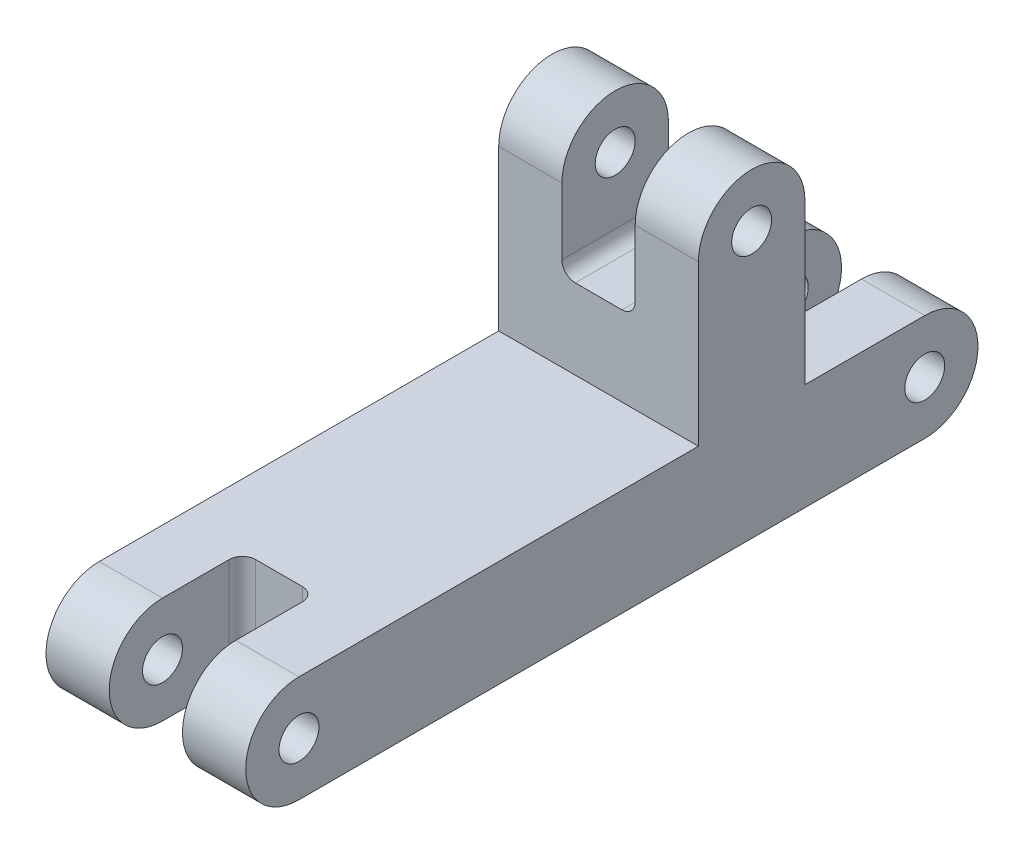
ISO-10303-21;
HEADER;
FILE_DESCRIPTION(('STEP AP214'),'2;1');
FILE_NAME('part.step','',(''),(''),'','','');
FILE_SCHEMA(('AUTOMOTIVE_DESIGN { 1 0 10303 214 1 1 1 1 }'));
ENDSEC;
DATA;
#1=APPLICATION_CONTEXT('core data for automotive mechanical design processes');
#2=APPLICATION_PROTOCOL_DEFINITION('international standard','automotive_design',2000,#1);
#3=PRODUCT_CONTEXT('',#1,'mechanical');
#4=PRODUCT('Part','Part','',(#3));
#5=PRODUCT_RELATED_PRODUCT_CATEGORY('part','',(#4));
#6=PRODUCT_DEFINITION_FORMATION('','',#4);
#7=PRODUCT_DEFINITION_CONTEXT('part definition',#1,'design');
#8=PRODUCT_DEFINITION('design','',#6,#7);
#9=PRODUCT_DEFINITION_SHAPE('','',#8);
#10=(LENGTH_UNIT() NAMED_UNIT(*) SI_UNIT(.MILLI.,.METRE.));
#11=(NAMED_UNIT(*) PLANE_ANGLE_UNIT() SI_UNIT($,.RADIAN.));
#12=(NAMED_UNIT(*) SI_UNIT($,.STERADIAN.) SOLID_ANGLE_UNIT());
#13=UNCERTAINTY_MEASURE_WITH_UNIT(LENGTH_MEASURE(1.E-05),#10,'distance_accuracy_value','');
#14=(GEOMETRIC_REPRESENTATION_CONTEXT(3) GLOBAL_UNCERTAINTY_ASSIGNED_CONTEXT((#13)) GLOBAL_UNIT_ASSIGNED_CONTEXT((#10,
#11,#12)) REPRESENTATION_CONTEXT('',''));
#15=CARTESIAN_POINT('',(0.,0.,0.));
#16=DIRECTION('',(0.,0.,1.));
#17=DIRECTION('',(1.,0.,0.));
#18=AXIS2_PLACEMENT_3D('',#15,#16,#17);
#19=CARTESIAN_POINT('',(7.5,0.,42.5));
#20=DIRECTION('',(-1.,0.,0.));
#21=DIRECTION('',(0.,0.,1.));
#22=AXIS2_PLACEMENT_3D('',#19,#20,#21);
#23=CYLINDRICAL_SURFACE('',#22,3.99999999999999);
#24=CARTESIAN_POINT('',(2.75,0.,42.5));
#25=DIRECTION('',(-1.,0.,0.));
#26=DIRECTION('',(0.,0.,1.));
#27=AXIS2_PLACEMENT_3D('',#24,#25,#26);
#28=CIRCLE('',#27,3.99999999999999);
#29=CARTESIAN_POINT('',(2.75,-3.99999999999999,42.5));
#30=VERTEX_POINT('',#29);
#31=CARTESIAN_POINT('',(2.75,3.99999999999999,42.5));
#32=VERTEX_POINT('',#31);
#33=EDGE_CURVE('E227',#30,#32,#28,.T.);
#34=ORIENTED_EDGE('',*,*,#33,.F.);
#35=DIRECTION('',(-1.,0.,0.));
#36=VECTOR('',#35,1.);
#37=CARTESIAN_POINT('',(7.5,-3.99999999999999,42.5));
#38=LINE('',#37,#36);
#39=CARTESIAN_POINT('',(7.5,-3.99999999999999,42.5));
#40=VERTEX_POINT('',#39);
#41=EDGE_CURVE('E243',#40,#30,#38,.T.);
#42=ORIENTED_EDGE('',*,*,#41,.F.);
#43=CARTESIAN_POINT('',(7.5,0.,42.5));
#44=DIRECTION('',(1.,0.,0.));
#45=DIRECTION('',(0.,0.,-1.));
#46=AXIS2_PLACEMENT_3D('',#43,#44,#45);
#47=CIRCLE('',#46,3.99999999999999);
#48=CARTESIAN_POINT('',(7.5,3.99999999999999,42.5));
#49=VERTEX_POINT('',#48);
#50=EDGE_CURVE('E236',#49,#40,#47,.T.);
#51=ORIENTED_EDGE('',*,*,#50,.F.);
#52=DIRECTION('',(-1.,0.,0.));
#53=VECTOR('',#52,1.);
#54=CARTESIAN_POINT('',(7.5,3.99999999999999,42.5));
#55=LINE('',#54,#53);
#56=EDGE_CURVE('E218',#49,#32,#55,.T.);
#57=ORIENTED_EDGE('',*,*,#56,.T.);
#58=EDGE_LOOP('',(#34,#42,#51,#57));
#59=FACE_BOUND('',#58,.T.);
#60=ADVANCED_FACE('F33',(#59),#23,.T.);
#61=CARTESIAN_POINT('',(7.5,-3.99999999999999,4.5));
#62=DIRECTION('',(0.,1.,0.));
#63=DIRECTION('',(0.,0.,1.));
#64=AXIS2_PLACEMENT_3D('',#61,#62,#63);
#65=PLANE('',#64);
#66=DIRECTION('',(1.,0.,0.));
#67=VECTOR('',#66,1.);
#68=CARTESIAN_POINT('',(-2.75,-3.99999999999999,36.5));
#69=LINE('',#68,#67);
#70=CARTESIAN_POINT('',(-1.75,-3.99999999999999,36.5));
#71=VERTEX_POINT('',#70);
#72=CARTESIAN_POINT('',(1.75,-3.99999999999999,36.5));
#73=VERTEX_POINT('',#72);
#74=EDGE_CURVE('E321',#71,#73,#69,.T.);
#75=ORIENTED_EDGE('',*,*,#74,.F.);
#76=CARTESIAN_POINT('',(-1.75,-3.99999999999999,37.5));
#77=DIRECTION('',(0.,1.,0.));
#78=DIRECTION('',(0.,0.,1.));
#79=AXIS2_PLACEMENT_3D('',#76,#77,#78);
#80=CIRCLE('',#79,1.);
#81=CARTESIAN_POINT('',(-2.75,-3.99999999999999,37.5));
#82=VERTEX_POINT('',#81);
#83=EDGE_CURVE('E11',#71,#82,#80,.T.);
#84=ORIENTED_EDGE('',*,*,#83,.T.);
#85=DIRECTION('',(0.,0.,-1.));
#86=VECTOR('',#85,1.);
#87=CARTESIAN_POINT('',(-2.75,-3.99999999999999,36.5));
#88=LINE('',#87,#86);
#89=CARTESIAN_POINT('',(-2.75,-3.99999999999999,42.5));
#90=VERTEX_POINT('',#89);
#91=EDGE_CURVE('E322',#90,#82,#88,.T.);
#92=ORIENTED_EDGE('',*,*,#91,.F.);
#93=CARTESIAN_POINT('',(-7.5,-3.99999999999999,42.5));
#94=VERTEX_POINT('',#93);
#95=EDGE_CURVE('E437',#90,#94,#38,.T.);
#96=ORIENTED_EDGE('',*,*,#95,.T.);
#97=DIRECTION('',(0.,0.,-1.));
#98=VECTOR('',#97,1.);
#99=CARTESIAN_POINT('',(-7.5,-3.99999999999999,4.5));
#100=LINE('',#99,#98);
#101=CARTESIAN_POINT('',(-7.5,-3.99999999999999,-4.5));
#102=VERTEX_POINT('',#101);
#103=EDGE_CURVE('E400',#94,#102,#100,.T.);
#104=ORIENTED_EDGE('',*,*,#103,.T.);
#105=DIRECTION('',(-1.,0.,0.));
#106=VECTOR('',#105,1.);
#107=CARTESIAN_POINT('',(7.5,-3.99999999999999,-4.5));
#108=LINE('',#107,#106);
#109=CARTESIAN_POINT('',(-2.75,-3.99999999999999,-4.5));
#110=VERTEX_POINT('',#109);
#111=EDGE_CURVE('E434',#110,#102,#108,.T.);
#112=ORIENTED_EDGE('',*,*,#111,.F.);
#113=DIRECTION('',(0.,0.,-1.));
#114=VECTOR('',#113,1.);
#115=CARTESIAN_POINT('',(-2.75,-3.99999999999999,7.5));
#116=LINE('',#115,#114);
#117=CARTESIAN_POINT('',(-2.75,-3.99999999999999,6.5));
#118=VERTEX_POINT('',#117);
#119=EDGE_CURVE('E335',#118,#110,#116,.T.);
#120=ORIENTED_EDGE('',*,*,#119,.F.);
#121=CARTESIAN_POINT('',(-1.75,-3.99999999999999,6.5));
#122=DIRECTION('',(0.,1.,0.));
#123=DIRECTION('',(0.,0.,1.));
#124=AXIS2_PLACEMENT_3D('',#121,#122,#123);
#125=CIRCLE('',#124,1.);
#126=CARTESIAN_POINT('',(-1.75,-3.99999999999999,7.5));
#127=VERTEX_POINT('',#126);
#128=EDGE_CURVE('E309',#118,#127,#125,.T.);
#129=ORIENTED_EDGE('',*,*,#128,.T.);
#130=DIRECTION('',(1.,0.,0.));
#131=VECTOR('',#130,1.);
#132=CARTESIAN_POINT('',(-2.75,-3.99999999999999,7.5));
#133=LINE('',#132,#131);
#134=CARTESIAN_POINT('',(1.75,-3.99999999999999,7.5));
#135=VERTEX_POINT('',#134);
#136=EDGE_CURVE('E349',#127,#135,#133,.T.);
#137=ORIENTED_EDGE('',*,*,#136,.T.);
#138=CARTESIAN_POINT('',(1.75,-3.99999999999999,6.5));
#139=DIRECTION('',(0.,1.,0.));
#140=DIRECTION('',(0.,0.,1.));
#141=AXIS2_PLACEMENT_3D('',#138,#139,#140);
#142=CIRCLE('',#141,1.);
#143=CARTESIAN_POINT('',(2.75,-3.99999999999999,6.5));
#144=VERTEX_POINT('',#143);
#145=EDGE_CURVE('E307',#135,#144,#142,.T.);
#146=ORIENTED_EDGE('',*,*,#145,.T.);
#147=DIRECTION('',(0.,0.,-1.));
#148=VECTOR('',#147,1.);
#149=CARTESIAN_POINT('',(2.75,-3.99999999999999,7.5));
#150=LINE('',#149,#148);
#151=CARTESIAN_POINT('',(2.75,-3.99999999999999,-4.5));
#152=VERTEX_POINT('',#151);
#153=EDGE_CURVE('E342',#144,#152,#150,.T.);
#154=ORIENTED_EDGE('',*,*,#153,.T.);
#155=CARTESIAN_POINT('',(7.5,-3.99999999999999,-4.5));
#156=VERTEX_POINT('',#155);
#157=EDGE_CURVE('E435',#156,#152,#108,.T.);
#158=ORIENTED_EDGE('',*,*,#157,.F.);
#159=DIRECTION('',(0.,0.,-1.));
#160=VECTOR('',#159,1.);
#161=CARTESIAN_POINT('',(7.5,-3.99999999999999,4.5));
#162=LINE('',#161,#160);
#163=EDGE_CURVE('E382',#40,#156,#162,.T.);
#164=ORIENTED_EDGE('',*,*,#163,.F.);
#165=ORIENTED_EDGE('',*,*,#41,.T.);
#166=DIRECTION('',(0.,0.,-1.));
#167=VECTOR('',#166,1.);
#168=CARTESIAN_POINT('',(2.75,-3.99999999999999,36.5));
#169=LINE('',#168,#167);
#170=CARTESIAN_POINT('',(2.75,-3.99999999999999,37.5));
#171=VERTEX_POINT('',#170);
#172=EDGE_CURVE('E223',#30,#171,#169,.T.);
#173=ORIENTED_EDGE('',*,*,#172,.T.);
#174=CARTESIAN_POINT('',(1.75,-3.99999999999999,37.5));
#175=DIRECTION('',(0.,1.,0.));
#176=DIRECTION('',(0.,0.,1.));
#177=AXIS2_PLACEMENT_3D('',#174,#175,#176);
#178=CIRCLE('',#177,1.);
#179=EDGE_CURVE('E312',#171,#73,#178,.T.);
#180=ORIENTED_EDGE('',*,*,#179,.T.);
#181=EDGE_LOOP('',(#75,#84,#92,#96,#104,#112,#120,#129,#137,#146,#154,#158,#164,#165,#173,#180));
#182=FACE_BOUND('',#181,.T.);
#183=ADVANCED_FACE('F450',(#182),#65,.F.);
#184=CARTESIAN_POINT('',(7.5,0.,-4.5));
#185=DIRECTION('',(-1.,0.,0.));
#186=DIRECTION('',(0.,0.,1.));
#187=AXIS2_PLACEMENT_3D('',#184,#185,#186);
#188=CYLINDRICAL_SURFACE('',#187,3.99999999999999);
#189=CARTESIAN_POINT('',(-2.75,0.,-4.5));
#190=DIRECTION('',(1.,0.,0.));
#191=DIRECTION('',(0.,0.,-1.));
#192=AXIS2_PLACEMENT_3D('',#189,#190,#191);
#193=CIRCLE('',#192,3.99999999999999);
#194=CARTESIAN_POINT('',(-2.75,3.99999999999999,-4.5));
#195=VERTEX_POINT('',#194);
#196=EDGE_CURVE('E267',#110,#195,#193,.T.);
#197=ORIENTED_EDGE('',*,*,#196,.F.);
#198=ORIENTED_EDGE('',*,*,#111,.T.);
#199=CARTESIAN_POINT('',(-7.5,0.,-4.5));
#200=DIRECTION('',(1.,0.,0.));
#201=DIRECTION('',(0.,0.,-1.));
#202=AXIS2_PLACEMENT_3D('',#199,#200,#201);
#203=CIRCLE('',#202,3.99999999999999);
#204=CARTESIAN_POINT('',(-7.5,3.99999999999999,-4.5));
#205=VERTEX_POINT('',#204);
#206=EDGE_CURVE('E403',#102,#205,#203,.T.);
#207=ORIENTED_EDGE('',*,*,#206,.T.);
#208=DIRECTION('',(-1.,0.,0.));
#209=VECTOR('',#208,1.);
#210=CARTESIAN_POINT('',(7.5,3.99999999999999,-4.5));
#211=LINE('',#210,#209);
#212=EDGE_CURVE('E430',#195,#205,#211,.T.);
#213=ORIENTED_EDGE('',*,*,#212,.F.);
#214=EDGE_LOOP('',(#197,#198,#207,#213));
#215=FACE_BOUND('',#214,.T.);
#216=ADVANCED_FACE('F444',(#215),#188,.T.);
#217=CARTESIAN_POINT('',(7.5,3.99999999999999,4.5));
#218=DIRECTION('',(0.,-1.,0.));
#219=DIRECTION('',(0.,0.,-1.));
#220=AXIS2_PLACEMENT_3D('',#217,#218,#219);
#221=PLANE('',#220);
#222=DIRECTION('',(0.,0.,1.));
#223=VECTOR('',#222,1.);
#224=CARTESIAN_POINT('',(-2.75,3.99999999999999,7.5));
#225=LINE('',#224,#223);
#226=CARTESIAN_POINT('',(-2.75,3.99999999999999,4.5));
#227=VERTEX_POINT('',#226);
#228=EDGE_CURVE('E341',#195,#227,#225,.T.);
#229=ORIENTED_EDGE('',*,*,#228,.F.);
#230=ORIENTED_EDGE('',*,*,#212,.T.);
#231=DIRECTION('',(0.,0.,1.));
#232=VECTOR('',#231,1.);
#233=CARTESIAN_POINT('',(-7.5,3.99999999999999,4.5));
#234=LINE('',#233,#232);
#235=CARTESIAN_POINT('',(-7.5,3.99999999999999,4.5));
#236=VERTEX_POINT('',#235);
#237=EDGE_CURVE('E406',#205,#236,#234,.T.);
#238=ORIENTED_EDGE('',*,*,#237,.T.);
#239=DIRECTION('',(-1.,0.,0.));
#240=VECTOR('',#239,1.);
#241=CARTESIAN_POINT('',(7.5,3.99999999999999,4.5));
#242=LINE('',#241,#240);
#243=EDGE_CURVE('E426',#227,#236,#242,.T.);
#244=ORIENTED_EDGE('',*,*,#243,.F.);
#245=EDGE_LOOP('',(#229,#230,#238,#244));
#246=FACE_BOUND('',#245,.T.);
#247=ADVANCED_FACE('F461',(#246),#221,.F.);
#248=CARTESIAN_POINT('',(7.5,16.,8.5));
#249=DIRECTION('',(-1.,0.,0.));
#250=DIRECTION('',(0.,0.,1.));
#251=AXIS2_PLACEMENT_3D('',#248,#249,#250);
#252=CYLINDRICAL_SURFACE('',#251,4.);
#253=CARTESIAN_POINT('',(2.75,16.,8.5));
#254=DIRECTION('',(-1.,0.,0.));
#255=DIRECTION('',(0.,0.,1.));
#256=AXIS2_PLACEMENT_3D('',#253,#254,#255);
#257=CIRCLE('',#256,4.);
#258=CARTESIAN_POINT('',(2.75,16.,12.5));
#259=VERTEX_POINT('',#258);
#260=CARTESIAN_POINT('',(2.75,16.,4.5));
#261=VERTEX_POINT('',#260);
#262=EDGE_CURVE('E256',#259,#261,#257,.T.);
#263=ORIENTED_EDGE('',*,*,#262,.F.);
#264=DIRECTION('',(-1.,0.,0.));
#265=VECTOR('',#264,1.);
#266=CARTESIAN_POINT('',(7.5,16.,12.5));
#267=LINE('',#266,#265);
#268=CARTESIAN_POINT('',(7.5,16.,12.5));
#269=VERTEX_POINT('',#268);
#270=EDGE_CURVE('E419',#269,#259,#267,.T.);
#271=ORIENTED_EDGE('',*,*,#270,.F.);
#272=CARTESIAN_POINT('',(7.5,16.,8.5));
#273=DIRECTION('',(1.,0.,0.));
#274=DIRECTION('',(0.,0.,-1.));
#275=AXIS2_PLACEMENT_3D('',#272,#273,#274);
#276=CIRCLE('',#275,4.);
#277=CARTESIAN_POINT('',(7.5,16.,4.5));
#278=VERTEX_POINT('',#277);
#279=EDGE_CURVE('E390',#278,#269,#276,.T.);
#280=ORIENTED_EDGE('',*,*,#279,.F.);
#281=DIRECTION('',(-1.,0.,0.));
#282=VECTOR('',#281,1.);
#283=CARTESIAN_POINT('',(7.5,16.,4.5));
#284=LINE('',#283,#282);
#285=EDGE_CURVE('E423',#278,#261,#284,.T.);
#286=ORIENTED_EDGE('',*,*,#285,.T.);
#287=EDGE_LOOP('',(#263,#271,#280,#286));
#288=FACE_BOUND('',#287,.T.);
#289=ADVANCED_FACE('F547',(#288),#252,.T.);
#290=CARTESIAN_POINT('',(7.5,0.,-4.5));
#291=DIRECTION('',(-1.,0.,0.));
#292=DIRECTION('',(0.,0.,1.));
#293=AXIS2_PLACEMENT_3D('',#290,#291,#292);
#294=CYLINDRICAL_SURFACE('',#293,1.5);
#295=CARTESIAN_POINT('',(-7.5,0.,-4.5));
#296=DIRECTION('',(1.,0.,0.));
#297=DIRECTION('',(0.,0.,-1.));
#298=AXIS2_PLACEMENT_3D('',#295,#296,#297);
#299=CIRCLE('',#298,1.5);
#300=CARTESIAN_POINT('',(-7.5,0.,-6.));
#301=VERTEX_POINT('',#300);
#302=EDGE_CURVE('E369',#301,#301,#299,.T.);
#303=ORIENTED_EDGE('',*,*,#302,.F.);
#304=EDGE_LOOP('',(#303));
#305=FACE_BOUND('',#304,.T.);
#306=CARTESIAN_POINT('',(-2.75,0.,-4.5));
#307=DIRECTION('',(1.,0.,0.));
#308=DIRECTION('',(0.,0.,-1.));
#309=AXIS2_PLACEMENT_3D('',#306,#307,#308);
#310=CIRCLE('',#309,1.5);
#311=CARTESIAN_POINT('',(-2.75,0.,-6.));
#312=VERTEX_POINT('',#311);
#313=EDGE_CURVE('E265',#312,#312,#310,.T.);
#314=ORIENTED_EDGE('',*,*,#313,.T.);
#315=EDGE_LOOP('',(#314));
#316=FACE_BOUND('',#315,.T.);
#317=ADVANCED_FACE('F607',(#305,#316),#294,.F.);
#318=CARTESIAN_POINT('',(7.5,16.,8.5));
#319=DIRECTION('',(-1.,0.,0.));
#320=DIRECTION('',(0.,0.,1.));
#321=AXIS2_PLACEMENT_3D('',#318,#319,#320);
#322=CYLINDRICAL_SURFACE('',#321,1.49999999999999);
#323=CARTESIAN_POINT('',(7.5,16.,8.5));
#324=DIRECTION('',(1.,0.,0.));
#325=DIRECTION('',(0.,0.,-1.));
#326=AXIS2_PLACEMENT_3D('',#323,#324,#325);
#327=CIRCLE('',#326,1.49999999999999);
#328=CARTESIAN_POINT('',(7.5,16.,7.00000000000001));
#329=VERTEX_POINT('',#328);
#330=EDGE_CURVE('E366',#329,#329,#327,.T.);
#331=ORIENTED_EDGE('',*,*,#330,.T.);
#332=EDGE_LOOP('',(#331));
#333=FACE_BOUND('',#332,.T.);
#334=CARTESIAN_POINT('',(2.75,16.,8.5));
#335=DIRECTION('',(-1.,0.,0.));
#336=DIRECTION('',(0.,0.,1.));
#337=AXIS2_PLACEMENT_3D('',#334,#335,#336);
#338=CIRCLE('',#337,1.49999999999999);
#339=CARTESIAN_POINT('',(2.75,16.,9.99999999999999));
#340=VERTEX_POINT('',#339);
#341=EDGE_CURVE('E253',#340,#340,#338,.T.);
#342=ORIENTED_EDGE('',*,*,#341,.T.);
#343=EDGE_LOOP('',(#342));
#344=FACE_BOUND('',#343,.T.);
#345=ADVANCED_FACE('F603',(#333,#344),#322,.F.);
#346=CARTESIAN_POINT('',(7.5,0.,42.5));
#347=DIRECTION('',(-1.,0.,0.));
#348=DIRECTION('',(0.,0.,1.));
#349=AXIS2_PLACEMENT_3D('',#346,#347,#348);
#350=CYLINDRICAL_SURFACE('',#349,1.5);
#351=CARTESIAN_POINT('',(7.5,0.,42.5));
#352=DIRECTION('',(1.,0.,0.));
#353=DIRECTION('',(0.,0.,-1.));
#354=AXIS2_PLACEMENT_3D('',#351,#352,#353);
#355=CIRCLE('',#354,1.5);
#356=CARTESIAN_POINT('',(7.5,0.,41.));
#357=VERTEX_POINT('',#356);
#358=EDGE_CURVE('E360',#357,#357,#355,.T.);
#359=ORIENTED_EDGE('',*,*,#358,.T.);
#360=EDGE_LOOP('',(#359));
#361=FACE_BOUND('',#360,.T.);
#362=CARTESIAN_POINT('',(2.75,0.,42.5));
#363=DIRECTION('',(-1.,0.,0.));
#364=DIRECTION('',(0.,0.,1.));
#365=AXIS2_PLACEMENT_3D('',#362,#363,#364);
#366=CIRCLE('',#365,1.5);
#367=CARTESIAN_POINT('',(2.75,0.,44.));
#368=VERTEX_POINT('',#367);
#369=EDGE_CURVE('E234',#368,#368,#366,.T.);
#370=ORIENTED_EDGE('',*,*,#369,.T.);
#371=EDGE_LOOP('',(#370));
#372=FACE_BOUND('',#371,.T.);
#373=ADVANCED_FACE('F598',(#361,#372),#350,.F.);
#374=CARTESIAN_POINT('',(7.5,0.,42.5));
#375=DIRECTION('',(1.,0.,0.));
#376=DIRECTION('',(0.,0.,-1.));
#377=AXIS2_PLACEMENT_3D('',#374,#375,#376);
#378=PLANE('',#377);
#379=ORIENTED_EDGE('',*,*,#330,.F.);
#380=EDGE_LOOP('',(#379));
#381=FACE_BOUND('',#380,.T.);
#382=DIRECTION('',(0.,0.,1.));
#383=VECTOR('',#382,1.);
#384=CARTESIAN_POINT('',(7.5,3.99999999999999,12.5));
#385=LINE('',#384,#383);
#386=CARTESIAN_POINT('',(7.5,3.99999999999999,12.5));
#387=VERTEX_POINT('',#386);
#388=EDGE_CURVE('E378',#387,#49,#385,.T.);
#389=ORIENTED_EDGE('',*,*,#388,.T.);
#390=ORIENTED_EDGE('',*,*,#50,.T.);
#391=ORIENTED_EDGE('',*,*,#163,.T.);
#392=CARTESIAN_POINT('',(7.5,0.,-4.5));
#393=DIRECTION('',(1.,0.,0.));
#394=DIRECTION('',(0.,0.,-1.));
#395=AXIS2_PLACEMENT_3D('',#392,#393,#394);
#396=CIRCLE('',#395,3.99999999999999);
#397=CARTESIAN_POINT('',(7.5,3.99999999999999,-4.5));
#398=VERTEX_POINT('',#397);
#399=EDGE_CURVE('E384',#156,#398,#396,.T.);
#400=ORIENTED_EDGE('',*,*,#399,.T.);
#401=DIRECTION('',(0.,0.,1.));
#402=VECTOR('',#401,1.);
#403=CARTESIAN_POINT('',(7.5,3.99999999999999,4.5));
#404=LINE('',#403,#402);
#405=CARTESIAN_POINT('',(7.5,3.99999999999999,4.5));
#406=VERTEX_POINT('',#405);
#407=EDGE_CURVE('E386',#398,#406,#404,.T.);
#408=ORIENTED_EDGE('',*,*,#407,.T.);
#409=DIRECTION('',(0.,1.,0.));
#410=VECTOR('',#409,1.);
#411=CARTESIAN_POINT('',(7.5,3.99999999999999,4.5));
#412=LINE('',#411,#410);
#413=EDGE_CURVE('E388',#406,#278,#412,.T.);
#414=ORIENTED_EDGE('',*,*,#413,.T.);
#415=ORIENTED_EDGE('',*,*,#279,.T.);
#416=DIRECTION('',(0.,-1.,0.));
#417=VECTOR('',#416,1.);
#418=CARTESIAN_POINT('',(7.5,3.99999999999999,12.5));
#419=LINE('',#418,#417);
#420=EDGE_CURVE('E392',#269,#387,#419,.T.);
#421=ORIENTED_EDGE('',*,*,#420,.T.);
#422=EDGE_LOOP('',(#389,#390,#391,#400,#408,#414,#415,#421));
#423=FACE_BOUND('',#422,.T.);
#424=CARTESIAN_POINT('',(7.5,0.,-4.5));
#425=DIRECTION('',(1.,0.,0.));
#426=DIRECTION('',(0.,0.,-1.));
#427=AXIS2_PLACEMENT_3D('',#424,#425,#426);
#428=CIRCLE('',#427,1.5);
#429=CARTESIAN_POINT('',(7.5,0.,-6.));
#430=VERTEX_POINT('',#429);
#431=EDGE_CURVE('E372',#430,#430,#428,.T.);
#432=ORIENTED_EDGE('',*,*,#431,.F.);
#433=EDGE_LOOP('',(#432));
#434=FACE_BOUND('',#433,.T.);
#435=ORIENTED_EDGE('',*,*,#358,.F.);
#436=EDGE_LOOP('',(#435));
#437=FACE_BOUND('',#436,.T.);
#438=ADVANCED_FACE('F497',(#381,#423,#434,#437),#378,.T.);
#439=CARTESIAN_POINT('',(-7.5,0.,42.5));
#440=DIRECTION('',(1.,0.,0.));
#441=DIRECTION('',(0.,0.,-1.));
#442=AXIS2_PLACEMENT_3D('',#439,#440,#441);
#443=PLANE('',#442);
#444=DIRECTION('',(0.,0.,1.));
#445=VECTOR('',#444,1.);
#446=CARTESIAN_POINT('',(-7.5,3.99999999999999,12.5));
#447=LINE('',#446,#445);
#448=CARTESIAN_POINT('',(-7.5,3.99999999999999,12.5));
#449=VERTEX_POINT('',#448);
#450=CARTESIAN_POINT('',(-7.5,3.99999999999999,42.5));
#451=VERTEX_POINT('',#450);
#452=EDGE_CURVE('E375',#449,#451,#447,.T.);
#453=ORIENTED_EDGE('',*,*,#452,.F.);
#454=DIRECTION('',(0.,-1.,0.));
#455=VECTOR('',#454,1.);
#456=CARTESIAN_POINT('',(-7.5,3.99999999999999,12.5));
#457=LINE('',#456,#455);
#458=CARTESIAN_POINT('',(-7.5,16.,12.5));
#459=VERTEX_POINT('',#458);
#460=EDGE_CURVE('E380',#459,#449,#457,.T.);
#461=ORIENTED_EDGE('',*,*,#460,.F.);
#462=CARTESIAN_POINT('',(-7.5,16.,8.5));
#463=DIRECTION('',(1.,0.,0.));
#464=DIRECTION('',(0.,0.,-1.));
#465=AXIS2_PLACEMENT_3D('',#462,#463,#464);
#466=CIRCLE('',#465,4.);
#467=CARTESIAN_POINT('',(-7.5,16.,4.5));
#468=VERTEX_POINT('',#467);
#469=EDGE_CURVE('E412',#468,#459,#466,.T.);
#470=ORIENTED_EDGE('',*,*,#469,.F.);
#471=DIRECTION('',(0.,1.,0.));
#472=VECTOR('',#471,1.);
#473=CARTESIAN_POINT('',(-7.5,3.99999999999999,4.5));
#474=LINE('',#473,#472);
#475=EDGE_CURVE('E409',#236,#468,#474,.T.);
#476=ORIENTED_EDGE('',*,*,#475,.F.);
#477=ORIENTED_EDGE('',*,*,#237,.F.);
#478=ORIENTED_EDGE('',*,*,#206,.F.);
#479=ORIENTED_EDGE('',*,*,#103,.F.);
#480=CARTESIAN_POINT('',(-7.5,0.,42.5));
#481=DIRECTION('',(1.,0.,0.));
#482=DIRECTION('',(0.,0.,-1.));
#483=AXIS2_PLACEMENT_3D('',#480,#481,#482);
#484=CIRCLE('',#483,3.99999999999999);
#485=EDGE_CURVE('E397',#451,#94,#484,.T.);
#486=ORIENTED_EDGE('',*,*,#485,.F.);
#487=EDGE_LOOP('',(#453,#461,#470,#476,#477,#478,#479,#486));
#488=FACE_BOUND('',#487,.T.);
#489=ORIENTED_EDGE('',*,*,#302,.T.);
#490=EDGE_LOOP('',(#489));
#491=FACE_BOUND('',#490,.T.);
#492=CARTESIAN_POINT('',(-7.5,16.,8.5));
#493=DIRECTION('',(1.,0.,0.));
#494=DIRECTION('',(0.,0.,-1.));
#495=AXIS2_PLACEMENT_3D('',#492,#493,#494);
#496=CIRCLE('',#495,1.49999999999999);
#497=CARTESIAN_POINT('',(-7.5,16.,7.00000000000001));
#498=VERTEX_POINT('',#497);
#499=EDGE_CURVE('E363',#498,#498,#496,.T.);
#500=ORIENTED_EDGE('',*,*,#499,.T.);
#501=EDGE_LOOP('',(#500));
#502=FACE_BOUND('',#501,.T.);
#503=CARTESIAN_POINT('',(-7.5,0.,42.5));
#504=DIRECTION('',(1.,0.,0.));
#505=DIRECTION('',(0.,0.,-1.));
#506=AXIS2_PLACEMENT_3D('',#503,#504,#505);
#507=CIRCLE('',#506,1.5);
#508=CARTESIAN_POINT('',(-7.5,0.,41.));
#509=VERTEX_POINT('',#508);
#510=EDGE_CURVE('E359',#509,#509,#507,.T.);
#511=ORIENTED_EDGE('',*,*,#510,.T.);
#512=EDGE_LOOP('',(#511));
#513=FACE_BOUND('',#512,.T.);
#514=ADVANCED_FACE('F454',(#488,#491,#502,#513),#443,.F.);
#515=CARTESIAN_POINT('',(7.5,3.99999999999999,12.5));
#516=DIRECTION('',(0.,-1.,0.));
#517=DIRECTION('',(0.,0.,-1.));
#518=AXIS2_PLACEMENT_3D('',#515,#516,#517);
#519=PLANE('',#518);
#520=CARTESIAN_POINT('',(-2.75,3.99999999999999,42.5));
#521=VERTEX_POINT('',#520);
#522=EDGE_CURVE('E239',#521,#451,#55,.T.);
#523=ORIENTED_EDGE('',*,*,#522,.F.);
#524=DIRECTION('',(0.,0.,1.));
#525=VECTOR('',#524,1.);
#526=CARTESIAN_POINT('',(-2.75,3.99999999999999,36.5));
#527=LINE('',#526,#525);
#528=CARTESIAN_POINT('',(-2.75,3.99999999999999,37.5));
#529=VERTEX_POINT('',#528);
#530=EDGE_CURVE('E316',#529,#521,#527,.T.);
#531=ORIENTED_EDGE('',*,*,#530,.F.);
#532=CARTESIAN_POINT('',(-1.75,3.99999999999999,37.5));
#533=DIRECTION('',(0.,-1.,0.));
#534=DIRECTION('',(0.,0.,-1.));
#535=AXIS2_PLACEMENT_3D('',#532,#533,#534);
#536=CIRCLE('',#535,1.);
#537=CARTESIAN_POINT('',(-1.75,3.99999999999999,36.5));
#538=VERTEX_POINT('',#537);
#539=EDGE_CURVE('E41',#529,#538,#536,.T.);
#540=ORIENTED_EDGE('',*,*,#539,.T.);
#541=DIRECTION('',(1.,0.,0.));
#542=VECTOR('',#541,1.);
#543=CARTESIAN_POINT('',(-2.75,3.99999999999999,36.5));
#544=LINE('',#543,#542);
#545=CARTESIAN_POINT('',(1.75,3.99999999999999,36.5));
#546=VERTEX_POINT('',#545);
#547=EDGE_CURVE('E315',#538,#546,#544,.T.);
#548=ORIENTED_EDGE('',*,*,#547,.T.);
#549=CARTESIAN_POINT('',(1.75,3.99999999999999,37.5));
#550=DIRECTION('',(0.,-1.,0.));
#551=DIRECTION('',(0.,0.,-1.));
#552=AXIS2_PLACEMENT_3D('',#549,#550,#551);
#553=CIRCLE('',#552,1.);
#554=CARTESIAN_POINT('',(2.75,3.99999999999999,37.5));
#555=VERTEX_POINT('',#554);
#556=EDGE_CURVE('E220',#546,#555,#553,.T.);
#557=ORIENTED_EDGE('',*,*,#556,.T.);
#558=DIRECTION('',(0.,0.,1.));
#559=VECTOR('',#558,1.);
#560=CARTESIAN_POINT('',(2.75,3.99999999999999,36.5));
#561=LINE('',#560,#559);
#562=EDGE_CURVE('E212',#555,#32,#561,.T.);
#563=ORIENTED_EDGE('',*,*,#562,.T.);
#564=ORIENTED_EDGE('',*,*,#56,.F.);
#565=ORIENTED_EDGE('',*,*,#388,.F.);
#566=DIRECTION('',(-1.,0.,0.));
#567=VECTOR('',#566,1.);
#568=CARTESIAN_POINT('',(7.5,3.99999999999999,12.5));
#569=LINE('',#568,#567);
#570=EDGE_CURVE('E394',#387,#449,#569,.T.);
#571=ORIENTED_EDGE('',*,*,#570,.T.);
#572=ORIENTED_EDGE('',*,*,#452,.T.);
#573=EDGE_LOOP('',(#523,#531,#540,#548,#557,#563,#564,#565,#571,#572));
#574=FACE_BOUND('',#573,.T.);
#575=ADVANCED_FACE('F215',(#574),#519,.F.);
#576=CARTESIAN_POINT('',(-2.75,0.,42.5));
#577=DIRECTION('',(-1.,0.,0.));
#578=DIRECTION('',(0.,0.,1.));
#579=AXIS2_PLACEMENT_3D('',#576,#577,#578);
#580=CIRCLE('',#579,3.99999999999999);
#581=EDGE_CURVE('E252',#90,#521,#580,.T.);
#582=ORIENTED_EDGE('',*,*,#581,.T.);
#583=ORIENTED_EDGE('',*,*,#522,.T.);
#584=ORIENTED_EDGE('',*,*,#485,.T.);
#585=ORIENTED_EDGE('',*,*,#95,.F.);
#586=EDGE_LOOP('',(#582,#583,#584,#585));
#587=FACE_BOUND('',#586,.T.);
#588=ADVANCED_FACE('F512',(#587),#23,.T.);
#589=CARTESIAN_POINT('',(2.75,0.,-4.5));
#590=DIRECTION('',(1.,0.,0.));
#591=DIRECTION('',(0.,0.,-1.));
#592=AXIS2_PLACEMENT_3D('',#589,#590,#591);
#593=CIRCLE('',#592,3.99999999999999);
#594=CARTESIAN_POINT('',(2.75,3.99999999999999,-4.5));
#595=VERTEX_POINT('',#594);
#596=EDGE_CURVE('E264',#152,#595,#593,.T.);
#597=ORIENTED_EDGE('',*,*,#596,.T.);
#598=EDGE_CURVE('E432',#398,#595,#211,.T.);
#599=ORIENTED_EDGE('',*,*,#598,.F.);
#600=ORIENTED_EDGE('',*,*,#399,.F.);
#601=ORIENTED_EDGE('',*,*,#157,.T.);
#602=EDGE_LOOP('',(#597,#599,#600,#601));
#603=FACE_BOUND('',#602,.T.);
#604=ADVANCED_FACE('F490',(#603),#188,.T.);
#605=ORIENTED_EDGE('',*,*,#598,.T.);
#606=DIRECTION('',(0.,0.,1.));
#607=VECTOR('',#606,1.);
#608=CARTESIAN_POINT('',(2.75,3.99999999999999,7.5));
#609=LINE('',#608,#607);
#610=CARTESIAN_POINT('',(2.75,3.99999999999999,4.5));
#611=VERTEX_POINT('',#610);
#612=EDGE_CURVE('E338',#595,#611,#609,.T.);
#613=ORIENTED_EDGE('',*,*,#612,.T.);
#614=EDGE_CURVE('E427',#406,#611,#242,.T.);
#615=ORIENTED_EDGE('',*,*,#614,.F.);
#616=ORIENTED_EDGE('',*,*,#407,.F.);
#617=EDGE_LOOP('',(#605,#613,#615,#616));
#618=FACE_BOUND('',#617,.T.);
#619=ADVANCED_FACE('F494',(#618),#221,.F.);
#620=CARTESIAN_POINT('',(7.5,3.99999999999999,4.5));
#621=DIRECTION('',(0.,0.,1.));
#622=DIRECTION('',(1.,0.,0.));
#623=AXIS2_PLACEMENT_3D('',#620,#621,#622);
#624=PLANE('',#623);
#625=CARTESIAN_POINT('',(-2.75,16.,4.5));
#626=VERTEX_POINT('',#625);
#627=EDGE_CURVE('E422',#626,#468,#284,.T.);
#628=ORIENTED_EDGE('',*,*,#627,.F.);
#629=DIRECTION('',(0.,1.,0.));
#630=VECTOR('',#629,1.);
#631=CARTESIAN_POINT('',(-2.75,9.99999999999999,4.5));
#632=LINE('',#631,#630);
#633=CARTESIAN_POINT('',(-2.75,11.,4.5));
#634=VERTEX_POINT('',#633);
#635=EDGE_CURVE('E564',#634,#626,#632,.T.);
#636=ORIENTED_EDGE('',*,*,#635,.F.);
#637=CARTESIAN_POINT('',(-1.75,11.,4.5));
#638=DIRECTION('',(0.,0.,1.));
#639=DIRECTION('',(1.,0.,0.));
#640=AXIS2_PLACEMENT_3D('',#637,#638,#639);
#641=CIRCLE('',#640,1.);
#642=CARTESIAN_POINT('',(-1.75,9.99999999999999,4.5));
#643=VERTEX_POINT('',#642);
#644=EDGE_CURVE('E303',#634,#643,#641,.T.);
#645=ORIENTED_EDGE('',*,*,#644,.T.);
#646=DIRECTION('',(1.,0.,0.));
#647=VECTOR('',#646,1.);
#648=CARTESIAN_POINT('',(-2.75,9.99999999999999,4.5));
#649=LINE('',#648,#647);
#650=CARTESIAN_POINT('',(1.75,9.99999999999999,4.5));
#651=VERTEX_POINT('',#650);
#652=EDGE_CURVE('E249',#643,#651,#649,.T.);
#653=ORIENTED_EDGE('',*,*,#652,.T.);
#654=CARTESIAN_POINT('',(1.75,11.,4.5));
#655=DIRECTION('',(0.,0.,1.));
#656=DIRECTION('',(1.,0.,0.));
#657=AXIS2_PLACEMENT_3D('',#654,#655,#656);
#658=CIRCLE('',#657,1.);
#659=CARTESIAN_POINT('',(2.75,11.,4.5));
#660=VERTEX_POINT('',#659);
#661=EDGE_CURVE('E299',#651,#660,#658,.T.);
#662=ORIENTED_EDGE('',*,*,#661,.T.);
#663=DIRECTION('',(0.,1.,0.));
#664=VECTOR('',#663,1.);
#665=CARTESIAN_POINT('',(2.75,9.99999999999999,4.5));
#666=LINE('',#665,#664);
#667=EDGE_CURVE('E543',#660,#261,#666,.T.);
#668=ORIENTED_EDGE('',*,*,#667,.T.);
#669=ORIENTED_EDGE('',*,*,#285,.F.);
#670=ORIENTED_EDGE('',*,*,#413,.F.);
#671=ORIENTED_EDGE('',*,*,#614,.T.);
#672=EDGE_CURVE('E431',#611,#227,#242,.T.);
#673=ORIENTED_EDGE('',*,*,#672,.T.);
#674=ORIENTED_EDGE('',*,*,#243,.T.);
#675=ORIENTED_EDGE('',*,*,#475,.T.);
#676=EDGE_LOOP('',(#628,#636,#645,#653,#662,#668,#669,#670,#671,#673,#674,#675));
#677=FACE_BOUND('',#676,.T.);
#678=ADVANCED_FACE('F540',(#677),#624,.F.);
#679=CARTESIAN_POINT('',(-2.75,16.,12.5));
#680=VERTEX_POINT('',#679);
#681=EDGE_CURVE('E418',#680,#459,#267,.T.);
#682=ORIENTED_EDGE('',*,*,#681,.F.);
#683=CARTESIAN_POINT('',(-2.75,16.,8.5));
#684=DIRECTION('',(-1.,0.,0.));
#685=DIRECTION('',(0.,0.,1.));
#686=AXIS2_PLACEMENT_3D('',#683,#684,#685);
#687=CIRCLE('',#686,4.);
#688=EDGE_CURVE('E260',#680,#626,#687,.T.);
#689=ORIENTED_EDGE('',*,*,#688,.T.);
#690=ORIENTED_EDGE('',*,*,#627,.T.);
#691=ORIENTED_EDGE('',*,*,#469,.T.);
#692=EDGE_LOOP('',(#682,#689,#690,#691));
#693=FACE_BOUND('',#692,.T.);
#694=ADVANCED_FACE('F536',(#693),#252,.T.);
#695=CARTESIAN_POINT('',(7.5,3.99999999999999,12.5));
#696=DIRECTION('',(0.,0.,-1.));
#697=DIRECTION('',(-1.,0.,0.));
#698=AXIS2_PLACEMENT_3D('',#695,#696,#697);
#699=PLANE('',#698);
#700=DIRECTION('',(1.,0.,0.));
#701=VECTOR('',#700,1.);
#702=CARTESIAN_POINT('',(-2.75,9.99999999999999,12.5));
#703=LINE('',#702,#701);
#704=CARTESIAN_POINT('',(-1.75,9.99999999999999,12.5));
#705=VERTEX_POINT('',#704);
#706=CARTESIAN_POINT('',(1.75,9.99999999999999,12.5));
#707=VERTEX_POINT('',#706);
#708=EDGE_CURVE('E562',#705,#707,#703,.T.);
#709=ORIENTED_EDGE('',*,*,#708,.F.);
#710=CARTESIAN_POINT('',(-1.75,11.,12.5));
#711=DIRECTION('',(0.,0.,-1.));
#712=DIRECTION('',(-1.,0.,0.));
#713=AXIS2_PLACEMENT_3D('',#710,#711,#712);
#714=CIRCLE('',#713,1.);
#715=CARTESIAN_POINT('',(-2.75,11.,12.5));
#716=VERTEX_POINT('',#715);
#717=EDGE_CURVE('E305',#705,#716,#714,.T.);
#718=ORIENTED_EDGE('',*,*,#717,.T.);
#719=DIRECTION('',(0.,-1.,0.));
#720=VECTOR('',#719,1.);
#721=CARTESIAN_POINT('',(-2.75,9.99999999999999,12.5));
#722=LINE('',#721,#720);
#723=EDGE_CURVE('E534',#680,#716,#722,.T.);
#724=ORIENTED_EDGE('',*,*,#723,.F.);
#725=ORIENTED_EDGE('',*,*,#681,.T.);
#726=ORIENTED_EDGE('',*,*,#460,.T.);
#727=ORIENTED_EDGE('',*,*,#570,.F.);
#728=ORIENTED_EDGE('',*,*,#420,.F.);
#729=ORIENTED_EDGE('',*,*,#270,.T.);
#730=DIRECTION('',(0.,-1.,0.));
#731=VECTOR('',#730,1.);
#732=CARTESIAN_POINT('',(2.75,9.99999999999999,12.5));
#733=LINE('',#732,#731);
#734=CARTESIAN_POINT('',(2.75,11.,12.5));
#735=VERTEX_POINT('',#734);
#736=EDGE_CURVE('E333',#259,#735,#733,.T.);
#737=ORIENTED_EDGE('',*,*,#736,.T.);
#738=CARTESIAN_POINT('',(1.75,11.,12.5));
#739=DIRECTION('',(0.,0.,-1.));
#740=DIRECTION('',(-1.,0.,0.));
#741=AXIS2_PLACEMENT_3D('',#738,#739,#740);
#742=CIRCLE('',#741,1.);
#743=EDGE_CURVE('E301',#735,#707,#742,.T.);
#744=ORIENTED_EDGE('',*,*,#743,.T.);
#745=EDGE_LOOP('',(#709,#718,#724,#725,#726,#727,#728,#729,#737,#744));
#746=FACE_BOUND('',#745,.T.);
#747=ADVANCED_FACE('F529',(#746),#699,.F.);
#748=CARTESIAN_POINT('',(2.75,0.,-4.5));
#749=DIRECTION('',(1.,0.,0.));
#750=DIRECTION('',(0.,0.,-1.));
#751=AXIS2_PLACEMENT_3D('',#748,#749,#750);
#752=CIRCLE('',#751,1.5);
#753=CARTESIAN_POINT('',(2.75,0.,-6.));
#754=VERTEX_POINT('',#753);
#755=EDGE_CURVE('E261',#754,#754,#752,.T.);
#756=ORIENTED_EDGE('',*,*,#755,.F.);
#757=EDGE_LOOP('',(#756));
#758=FACE_BOUND('',#757,.T.);
#759=ORIENTED_EDGE('',*,*,#431,.T.);
#760=EDGE_LOOP('',(#759));
#761=FACE_BOUND('',#760,.T.);
#762=ADVANCED_FACE('F601',(#758,#761),#294,.F.);
#763=CARTESIAN_POINT('',(-2.75,16.,8.5));
#764=DIRECTION('',(-1.,0.,0.));
#765=DIRECTION('',(0.,0.,1.));
#766=AXIS2_PLACEMENT_3D('',#763,#764,#765);
#767=CIRCLE('',#766,1.49999999999999);
#768=CARTESIAN_POINT('',(-2.75,16.,9.99999999999999));
#769=VERTEX_POINT('',#768);
#770=EDGE_CURVE('E257',#769,#769,#767,.T.);
#771=ORIENTED_EDGE('',*,*,#770,.F.);
#772=EDGE_LOOP('',(#771));
#773=FACE_BOUND('',#772,.T.);
#774=ORIENTED_EDGE('',*,*,#499,.F.);
#775=EDGE_LOOP('',(#774));
#776=FACE_BOUND('',#775,.T.);
#777=ADVANCED_FACE('F596',(#773,#776),#322,.F.);
#778=CARTESIAN_POINT('',(-2.75,0.,42.5));
#779=DIRECTION('',(-1.,0.,0.));
#780=DIRECTION('',(0.,0.,1.));
#781=AXIS2_PLACEMENT_3D('',#778,#779,#780);
#782=CIRCLE('',#781,1.5);
#783=CARTESIAN_POINT('',(-2.75,0.,44.));
#784=VERTEX_POINT('',#783);
#785=EDGE_CURVE('E233',#784,#784,#782,.T.);
#786=ORIENTED_EDGE('',*,*,#785,.F.);
#787=EDGE_LOOP('',(#786));
#788=FACE_BOUND('',#787,.T.);
#789=ORIENTED_EDGE('',*,*,#510,.F.);
#790=EDGE_LOOP('',(#789));
#791=FACE_BOUND('',#790,.T.);
#792=ADVANCED_FACE('F593',(#788,#791),#350,.F.);
#793=CARTESIAN_POINT('',(-2.75,0.,0.));
#794=DIRECTION('',(-1.,0.,0.));
#795=DIRECTION('',(0.,0.,1.));
#796=AXIS2_PLACEMENT_3D('',#793,#794,#795);
#797=PLANE('',#796);
#798=ORIENTED_EDGE('',*,*,#785,.T.);
#799=EDGE_LOOP('',(#798));
#800=FACE_BOUND('',#799,.T.);
#801=ORIENTED_EDGE('',*,*,#91,.T.);
#802=DIRECTION('',(0.,1.,0.));
#803=VECTOR('',#802,1.);
#804=CARTESIAN_POINT('',(-2.75,3.99999999999999,37.5));
#805=LINE('',#804,#803);
#806=EDGE_CURVE('E297',#82,#529,#805,.T.);
#807=ORIENTED_EDGE('',*,*,#806,.T.);
#808=ORIENTED_EDGE('',*,*,#530,.T.);
#809=ORIENTED_EDGE('',*,*,#581,.F.);
#810=EDGE_LOOP('',(#801,#807,#808,#809));
#811=FACE_BOUND('',#810,.T.);
#812=ADVANCED_FACE('F325',(#800,#811),#797,.F.);
#813=CARTESIAN_POINT('',(2.75,0.,0.));
#814=DIRECTION('',(-1.,0.,0.));
#815=DIRECTION('',(0.,0.,1.));
#816=AXIS2_PLACEMENT_3D('',#813,#814,#815);
#817=PLANE('',#816);
#818=ORIENTED_EDGE('',*,*,#369,.F.);
#819=EDGE_LOOP('',(#818));
#820=FACE_BOUND('',#819,.T.);
#821=ORIENTED_EDGE('',*,*,#562,.F.);
#822=DIRECTION('',(0.,1.,0.));
#823=VECTOR('',#822,1.);
#824=CARTESIAN_POINT('',(2.75,0.,37.5));
#825=LINE('',#824,#823);
#826=EDGE_CURVE('E295',#555,#171,#825,.F.);
#827=ORIENTED_EDGE('',*,*,#826,.T.);
#828=ORIENTED_EDGE('',*,*,#172,.F.);
#829=ORIENTED_EDGE('',*,*,#33,.T.);
#830=EDGE_LOOP('',(#821,#827,#828,#829));
#831=FACE_BOUND('',#830,.T.);
#832=ADVANCED_FACE('F228',(#820,#831),#817,.T.);
#833=CARTESIAN_POINT('',(-2.75,3.99999999999999,36.5));
#834=DIRECTION('',(0.,0.,-1.));
#835=DIRECTION('',(-1.,0.,0.));
#836=AXIS2_PLACEMENT_3D('',#833,#834,#835);
#837=PLANE('',#836);
#838=ORIENTED_EDGE('',*,*,#74,.T.);
#839=DIRECTION('',(0.,1.,0.));
#840=VECTOR('',#839,1.);
#841=CARTESIAN_POINT('',(1.75,3.99999999999999,36.5));
#842=LINE('',#841,#840);
#843=EDGE_CURVE('E292',#73,#546,#842,.T.);
#844=ORIENTED_EDGE('',*,*,#843,.T.);
#845=ORIENTED_EDGE('',*,*,#547,.F.);
#846=DIRECTION('',(0.,1.,0.));
#847=VECTOR('',#846,1.);
#848=CARTESIAN_POINT('',(-1.75,-3.99999999999999,36.5));
#849=LINE('',#848,#847);
#850=EDGE_CURVE('E290',#538,#71,#849,.F.);
#851=ORIENTED_EDGE('',*,*,#850,.T.);
#852=EDGE_LOOP('',(#838,#844,#845,#851));
#853=FACE_BOUND('',#852,.T.);
#854=ADVANCED_FACE('F319',(#853),#837,.F.);
#855=CARTESIAN_POINT('',(-2.75,0.,0.));
#856=DIRECTION('',(-1.,0.,0.));
#857=DIRECTION('',(0.,0.,1.));
#858=AXIS2_PLACEMENT_3D('',#855,#856,#857);
#859=PLANE('',#858);
#860=ORIENTED_EDGE('',*,*,#770,.T.);
#861=EDGE_LOOP('',(#860));
#862=FACE_BOUND('',#861,.T.);
#863=ORIENTED_EDGE('',*,*,#723,.T.);
#864=DIRECTION('',(0.,0.,-1.));
#865=VECTOR('',#864,1.);
#866=CARTESIAN_POINT('',(-2.75,11.,4.5));
#867=LINE('',#866,#865);
#868=EDGE_CURVE('E273',#716,#634,#867,.T.);
#869=ORIENTED_EDGE('',*,*,#868,.T.);
#870=ORIENTED_EDGE('',*,*,#635,.T.);
#871=ORIENTED_EDGE('',*,*,#688,.F.);
#872=EDGE_LOOP('',(#863,#869,#870,#871));
#873=FACE_BOUND('',#872,.T.);
#874=ADVANCED_FACE('F570',(#862,#873),#859,.F.);
#875=CARTESIAN_POINT('',(2.75,0.,0.));
#876=DIRECTION('',(-1.,0.,0.));
#877=DIRECTION('',(0.,0.,1.));
#878=AXIS2_PLACEMENT_3D('',#875,#876,#877);
#879=PLANE('',#878);
#880=ORIENTED_EDGE('',*,*,#341,.F.);
#881=EDGE_LOOP('',(#880));
#882=FACE_BOUND('',#881,.T.);
#883=ORIENTED_EDGE('',*,*,#667,.F.);
#884=DIRECTION('',(0.,0.,-1.));
#885=VECTOR('',#884,1.);
#886=CARTESIAN_POINT('',(2.75,11.,0.));
#887=LINE('',#886,#885);
#888=EDGE_CURVE('E271',#660,#735,#887,.F.);
#889=ORIENTED_EDGE('',*,*,#888,.T.);
#890=ORIENTED_EDGE('',*,*,#736,.F.);
#891=ORIENTED_EDGE('',*,*,#262,.T.);
#892=EDGE_LOOP('',(#883,#889,#890,#891));
#893=FACE_BOUND('',#892,.T.);
#894=ADVANCED_FACE('F697',(#882,#893),#879,.T.);
#895=CARTESIAN_POINT('',(-2.75,9.99999999999999,12.5));
#896=DIRECTION('',(0.,-1.,0.));
#897=DIRECTION('',(0.,0.,-1.));
#898=AXIS2_PLACEMENT_3D('',#895,#896,#897);
#899=PLANE('',#898);
#900=ORIENTED_EDGE('',*,*,#708,.T.);
#901=DIRECTION('',(0.,0.,-1.));
#902=VECTOR('',#901,1.);
#903=CARTESIAN_POINT('',(1.75,9.99999999999999,12.5));
#904=LINE('',#903,#902);
#905=EDGE_CURVE('E241',#707,#651,#904,.T.);
#906=ORIENTED_EDGE('',*,*,#905,.T.);
#907=ORIENTED_EDGE('',*,*,#652,.F.);
#908=DIRECTION('',(0.,0.,-1.));
#909=VECTOR('',#908,1.);
#910=CARTESIAN_POINT('',(-1.75,9.99999999999999,12.5));
#911=LINE('',#910,#909);
#912=EDGE_CURVE('E238',#643,#705,#911,.F.);
#913=ORIENTED_EDGE('',*,*,#912,.T.);
#914=EDGE_LOOP('',(#900,#906,#907,#913));
#915=FACE_BOUND('',#914,.T.);
#916=ADVANCED_FACE('F560',(#915),#899,.F.);
#917=CARTESIAN_POINT('',(-2.75,3.99999999999999,7.5));
#918=DIRECTION('',(0.,1.,0.));
#919=DIRECTION('',(0.,0.,1.));
#920=AXIS2_PLACEMENT_3D('',#917,#918,#919);
#921=PLANE('',#920);
#922=CARTESIAN_POINT('',(2.75,3.99999999999999,6.5));
#923=VERTEX_POINT('',#922);
#924=EDGE_CURVE('E344',#611,#923,#609,.T.);
#925=ORIENTED_EDGE('',*,*,#924,.T.);
#926=CARTESIAN_POINT('',(1.75,3.99999999999999,6.5));
#927=DIRECTION('',(0.,1.,0.));
#928=DIRECTION('',(0.,0.,1.));
#929=AXIS2_PLACEMENT_3D('',#926,#927,#928);
#930=CIRCLE('',#929,1.);
#931=CARTESIAN_POINT('',(1.75,3.99999999999999,7.5));
#932=VERTEX_POINT('',#931);
#933=EDGE_CURVE('E285',#923,#932,#930,.F.);
#934=ORIENTED_EDGE('',*,*,#933,.T.);
#935=DIRECTION('',(1.,0.,0.));
#936=VECTOR('',#935,1.);
#937=CARTESIAN_POINT('',(-2.75,3.99999999999999,7.5));
#938=LINE('',#937,#936);
#939=CARTESIAN_POINT('',(-1.75,3.99999999999999,7.5));
#940=VERTEX_POINT('',#939);
#941=EDGE_CURVE('E224',#940,#932,#938,.T.);
#942=ORIENTED_EDGE('',*,*,#941,.F.);
#943=CARTESIAN_POINT('',(-1.75,3.99999999999999,6.5));
#944=DIRECTION('',(0.,1.,0.));
#945=DIRECTION('',(0.,0.,1.));
#946=AXIS2_PLACEMENT_3D('',#943,#944,#945);
#947=CIRCLE('',#946,1.);
#948=CARTESIAN_POINT('',(-2.75,3.99999999999999,6.5));
#949=VERTEX_POINT('',#948);
#950=EDGE_CURVE('E283',#940,#949,#947,.F.);
#951=ORIENTED_EDGE('',*,*,#950,.T.);
#952=EDGE_CURVE('E337',#227,#949,#225,.T.);
#953=ORIENTED_EDGE('',*,*,#952,.F.);
#954=ORIENTED_EDGE('',*,*,#672,.F.);
#955=EDGE_LOOP('',(#925,#934,#942,#951,#953,#954));
#956=FACE_BOUND('',#955,.T.);
#957=ADVANCED_FACE('F468',(#956),#921,.F.);
#958=CARTESIAN_POINT('',(-2.75,0.,0.));
#959=DIRECTION('',(1.,0.,0.));
#960=DIRECTION('',(0.,0.,-1.));
#961=AXIS2_PLACEMENT_3D('',#958,#959,#960);
#962=PLANE('',#961);
#963=ORIENTED_EDGE('',*,*,#313,.F.);
#964=EDGE_LOOP('',(#963));
#965=FACE_BOUND('',#964,.T.);
#966=ORIENTED_EDGE('',*,*,#952,.T.);
#967=DIRECTION('',(0.,-1.,0.));
#968=VECTOR('',#967,1.);
#969=CARTESIAN_POINT('',(-2.75,0.,6.5));
#970=LINE('',#969,#968);
#971=EDGE_CURVE('E287',#949,#118,#970,.T.);
#972=ORIENTED_EDGE('',*,*,#971,.T.);
#973=ORIENTED_EDGE('',*,*,#119,.T.);
#974=ORIENTED_EDGE('',*,*,#196,.T.);
#975=ORIENTED_EDGE('',*,*,#228,.T.);
#976=EDGE_LOOP('',(#966,#972,#973,#974,#975));
#977=FACE_BOUND('',#976,.T.);
#978=ADVANCED_FACE('F465',(#965,#977),#962,.T.);
#979=CARTESIAN_POINT('',(2.75,0.,0.));
#980=DIRECTION('',(1.,0.,0.));
#981=DIRECTION('',(0.,0.,-1.));
#982=AXIS2_PLACEMENT_3D('',#979,#980,#981);
#983=PLANE('',#982);
#984=ORIENTED_EDGE('',*,*,#755,.T.);
#985=EDGE_LOOP('',(#984));
#986=FACE_BOUND('',#985,.T.);
#987=ORIENTED_EDGE('',*,*,#153,.F.);
#988=DIRECTION('',(0.,-1.,0.));
#989=VECTOR('',#988,1.);
#990=CARTESIAN_POINT('',(2.75,3.99999999999999,6.5));
#991=LINE('',#990,#989);
#992=EDGE_CURVE('E281',#144,#923,#991,.F.);
#993=ORIENTED_EDGE('',*,*,#992,.T.);
#994=ORIENTED_EDGE('',*,*,#924,.F.);
#995=ORIENTED_EDGE('',*,*,#612,.F.);
#996=ORIENTED_EDGE('',*,*,#596,.F.);
#997=EDGE_LOOP('',(#987,#993,#994,#995,#996));
#998=FACE_BOUND('',#997,.T.);
#999=ADVANCED_FACE('F486',(#986,#998),#983,.F.);
#1000=CARTESIAN_POINT('',(-2.75,3.99999999999999,7.5));
#1001=DIRECTION('',(0.,0.,1.));
#1002=DIRECTION('',(0.,-1.,0.));
#1003=AXIS2_PLACEMENT_3D('',#1000,#1001,#1002);
#1004=PLANE('',#1003);
#1005=ORIENTED_EDGE('',*,*,#941,.T.);
#1006=DIRECTION('',(0.,-1.,0.));
#1007=VECTOR('',#1006,1.);
#1008=CARTESIAN_POINT('',(1.75,-3.99999999999999,7.5));
#1009=LINE('',#1008,#1007);
#1010=EDGE_CURVE('E278',#932,#135,#1009,.T.);
#1011=ORIENTED_EDGE('',*,*,#1010,.T.);
#1012=ORIENTED_EDGE('',*,*,#136,.F.);
#1013=DIRECTION('',(0.,-1.,0.));
#1014=VECTOR('',#1013,1.);
#1015=CARTESIAN_POINT('',(-1.75,3.99999999999999,7.5));
#1016=LINE('',#1015,#1014);
#1017=EDGE_CURVE('E276',#127,#940,#1016,.F.);
#1018=ORIENTED_EDGE('',*,*,#1017,.T.);
#1019=EDGE_LOOP('',(#1005,#1011,#1012,#1018));
#1020=FACE_BOUND('',#1019,.T.);
#1021=ADVANCED_FACE('F477',(#1020),#1004,.F.);
#1022=CARTESIAN_POINT('',(1.75,11.,12.5));
#1023=DIRECTION('',(0.,0.,-1.));
#1024=DIRECTION('',(-1.,0.,0.));
#1025=AXIS2_PLACEMENT_3D('',#1022,#1023,#1024);
#1026=CYLINDRICAL_SURFACE('',#1025,1.);
#1027=ORIENTED_EDGE('',*,*,#743,.F.);
#1028=ORIENTED_EDGE('',*,*,#888,.F.);
#1029=ORIENTED_EDGE('',*,*,#661,.F.);
#1030=ORIENTED_EDGE('',*,*,#905,.F.);
#1031=EDGE_LOOP('',(#1027,#1028,#1029,#1030));
#1032=FACE_BOUND('',#1031,.T.);
#1033=ADVANCED_FACE('F556',(#1032),#1026,.F.);
#1034=CARTESIAN_POINT('',(-1.75,11.,0.));
#1035=DIRECTION('',(0.,0.,1.));
#1036=DIRECTION('',(1.,0.,0.));
#1037=AXIS2_PLACEMENT_3D('',#1034,#1035,#1036);
#1038=CYLINDRICAL_SURFACE('',#1037,1.);
#1039=ORIENTED_EDGE('',*,*,#717,.F.);
#1040=ORIENTED_EDGE('',*,*,#912,.F.);
#1041=ORIENTED_EDGE('',*,*,#644,.F.);
#1042=ORIENTED_EDGE('',*,*,#868,.F.);
#1043=EDGE_LOOP('',(#1039,#1040,#1041,#1042));
#1044=FACE_BOUND('',#1043,.T.);
#1045=ADVANCED_FACE('F573',(#1044),#1038,.F.);
#1046=CARTESIAN_POINT('',(1.75,3.99999999999999,6.5));
#1047=DIRECTION('',(0.,1.,0.));
#1048=DIRECTION('',(0.,0.,1.));
#1049=AXIS2_PLACEMENT_3D('',#1046,#1047,#1048);
#1050=CYLINDRICAL_SURFACE('',#1049,1.);
#1051=ORIENTED_EDGE('',*,*,#933,.F.);
#1052=ORIENTED_EDGE('',*,*,#992,.F.);
#1053=ORIENTED_EDGE('',*,*,#145,.F.);
#1054=ORIENTED_EDGE('',*,*,#1010,.F.);
#1055=EDGE_LOOP('',(#1051,#1052,#1053,#1054));
#1056=FACE_BOUND('',#1055,.T.);
#1057=ADVANCED_FACE('F481',(#1056),#1050,.F.);
#1058=CARTESIAN_POINT('',(-1.75,0.,6.5));
#1059=DIRECTION('',(0.,-1.,0.));
#1060=DIRECTION('',(0.,0.,-1.));
#1061=AXIS2_PLACEMENT_3D('',#1058,#1059,#1060);
#1062=CYLINDRICAL_SURFACE('',#1061,1.);
#1063=ORIENTED_EDGE('',*,*,#950,.F.);
#1064=ORIENTED_EDGE('',*,*,#1017,.F.);
#1065=ORIENTED_EDGE('',*,*,#128,.F.);
#1066=ORIENTED_EDGE('',*,*,#971,.F.);
#1067=EDGE_LOOP('',(#1063,#1064,#1065,#1066));
#1068=FACE_BOUND('',#1067,.T.);
#1069=ADVANCED_FACE('F474',(#1068),#1062,.F.);
#1070=CARTESIAN_POINT('',(1.75,3.99999999999999,37.5));
#1071=DIRECTION('',(0.,1.,0.));
#1072=DIRECTION('',(0.,0.,1.));
#1073=AXIS2_PLACEMENT_3D('',#1070,#1071,#1072);
#1074=CYLINDRICAL_SURFACE('',#1073,1.);
#1075=ORIENTED_EDGE('',*,*,#179,.F.);
#1076=ORIENTED_EDGE('',*,*,#826,.F.);
#1077=ORIENTED_EDGE('',*,*,#556,.F.);
#1078=ORIENTED_EDGE('',*,*,#843,.F.);
#1079=EDGE_LOOP('',(#1075,#1076,#1077,#1078));
#1080=FACE_BOUND('',#1079,.T.);
#1081=ADVANCED_FACE('F503',(#1080),#1074,.F.);
#1082=CARTESIAN_POINT('',(-1.75,0.,37.5));
#1083=DIRECTION('',(0.,-1.,0.));
#1084=DIRECTION('',(0.,0.,-1.));
#1085=AXIS2_PLACEMENT_3D('',#1082,#1083,#1084);
#1086=CYLINDRICAL_SURFACE('',#1085,1.);
#1087=ORIENTED_EDGE('',*,*,#83,.F.);
#1088=ORIENTED_EDGE('',*,*,#850,.F.);
#1089=ORIENTED_EDGE('',*,*,#539,.F.);
#1090=ORIENTED_EDGE('',*,*,#806,.F.);
#1091=EDGE_LOOP('',(#1087,#1088,#1089,#1090));
#1092=FACE_BOUND('',#1091,.T.);
#1093=ADVANCED_FACE('F35',(#1092),#1086,.F.);
#1094=CLOSED_SHELL('',(#60,#183,#216,#247,#289,#317,#345,#373,#438,#514,#575,#588,#604,#619,
#678,#694,#747,#762,#777,#792,#812,#832,#854,#874,#894,#916,#957,#978,#999,#1021,#1033,#1045,
#1057,#1069,#1081,#1093));
#1095=MANIFOLD_SOLID_BREP('B2',#1094);
#1096=ADVANCED_BREP_SHAPE_REPRESENTATION('',(#18,#1095),#14);
#1097=SHAPE_DEFINITION_REPRESENTATION(#9,#1096);
ENDSEC;
END-ISO-10303-21;
